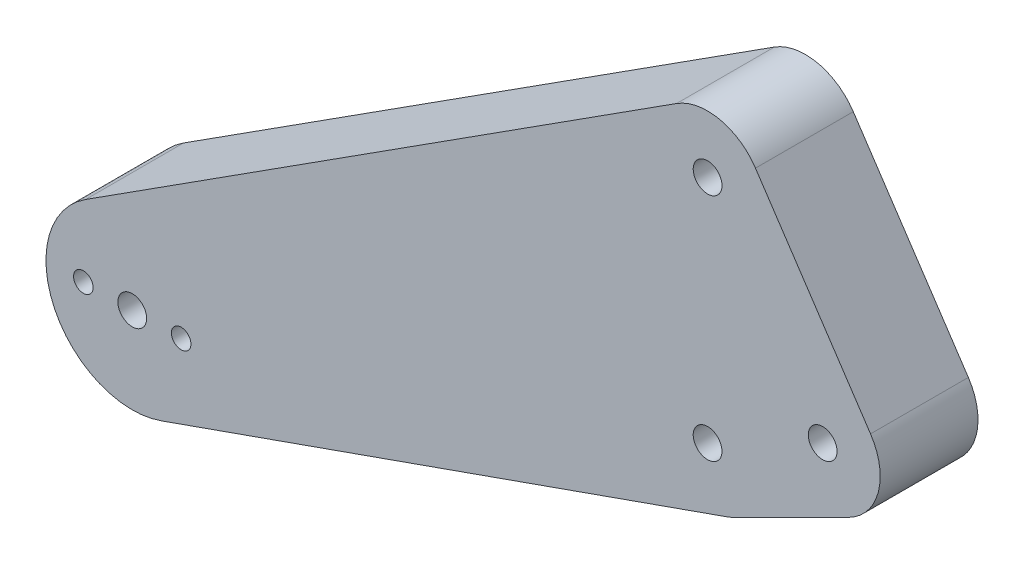
ISO-10303-21;
HEADER;
FILE_DESCRIPTION(('STEP AP214'),'2;1');
FILE_NAME('part.step','',(''),(''),'','','');
FILE_SCHEMA(('AUTOMOTIVE_DESIGN { 1 0 10303 214 1 1 1 1 }'));
ENDSEC;
DATA;
#1=APPLICATION_CONTEXT('core data for automotive mechanical design processes');
#2=APPLICATION_PROTOCOL_DEFINITION('international standard','automotive_design',2000,#1);
#3=PRODUCT_CONTEXT('',#1,'mechanical');
#4=PRODUCT('Part','Part','',(#3));
#5=PRODUCT_RELATED_PRODUCT_CATEGORY('part','',(#4));
#6=PRODUCT_DEFINITION_FORMATION('','',#4);
#7=PRODUCT_DEFINITION_CONTEXT('part definition',#1,'design');
#8=PRODUCT_DEFINITION('design','',#6,#7);
#9=PRODUCT_DEFINITION_SHAPE('','',#8);
#10=(LENGTH_UNIT() NAMED_UNIT(*) SI_UNIT(.MILLI.,.METRE.));
#11=(NAMED_UNIT(*) PLANE_ANGLE_UNIT() SI_UNIT($,.RADIAN.));
#12=(NAMED_UNIT(*) SI_UNIT($,.STERADIAN.) SOLID_ANGLE_UNIT());
#13=UNCERTAINTY_MEASURE_WITH_UNIT(LENGTH_MEASURE(1.E-05),#10,'distance_accuracy_value','');
#14=(GEOMETRIC_REPRESENTATION_CONTEXT(3) GLOBAL_UNCERTAINTY_ASSIGNED_CONTEXT((#13)) GLOBAL_UNIT_ASSIGNED_CONTEXT((#10,
#11,#12)) REPRESENTATION_CONTEXT('',''));
#15=CARTESIAN_POINT('',(0.,0.,0.));
#16=DIRECTION('',(0.,0.,1.));
#17=DIRECTION('',(1.,0.,0.));
#18=AXIS2_PLACEMENT_3D('',#15,#16,#17);
#19=CARTESIAN_POINT('',(0.,40.,17.));
#20=DIRECTION('',(0.,0.,-1.));
#21=DIRECTION('',(-1.,0.,0.));
#22=AXIS2_PLACEMENT_3D('',#19,#20,#21);
#23=CYLINDRICAL_SURFACE('',#22,10.);
#24=CARTESIAN_POINT('',(0.,40.,0.));
#25=DIRECTION('',(0.,0.,1.));
#26=DIRECTION('',(-1.,0.,0.));
#27=AXIS2_PLACEMENT_3D('',#24,#25,#26);
#28=CIRCLE('',#27,10.);
#29=CARTESIAN_POINT('',(8.32050294337844,45.5470019622523,0.));
#30=VERTEX_POINT('',#29);
#31=CARTESIAN_POINT('',(-5.3942400284264,48.420342897752,0.));
#32=VERTEX_POINT('',#31);
#33=EDGE_CURVE('E136',#30,#32,#28,.T.);
#34=ORIENTED_EDGE('',*,*,#33,.T.);
#35=DIRECTION('',(0.,0.,-1.));
#36=VECTOR('',#35,1.);
#37=CARTESIAN_POINT('',(-5.3942400284264,48.420342897752,17.));
#38=LINE('',#37,#36);
#39=CARTESIAN_POINT('',(-5.3942400284264,48.420342897752,17.));
#40=VERTEX_POINT('',#39);
#41=EDGE_CURVE('E11',#40,#32,#38,.T.);
#42=ORIENTED_EDGE('',*,*,#41,.F.);
#43=CARTESIAN_POINT('',(0.,40.,17.));
#44=DIRECTION('',(0.,0.,1.));
#45=DIRECTION('',(-1.,0.,0.));
#46=AXIS2_PLACEMENT_3D('',#43,#44,#45);
#47=CIRCLE('',#46,10.);
#48=CARTESIAN_POINT('',(8.32050294337844,45.5470019622523,17.));
#49=VERTEX_POINT('',#48);
#50=EDGE_CURVE('E151',#49,#40,#47,.T.);
#51=ORIENTED_EDGE('',*,*,#50,.F.);
#52=DIRECTION('',(0.,0.,-1.));
#53=VECTOR('',#52,1.);
#54=CARTESIAN_POINT('',(8.32050294337844,45.5470019622523,17.));
#55=LINE('',#54,#53);
#56=EDGE_CURVE('E132',#49,#30,#55,.T.);
#57=ORIENTED_EDGE('',*,*,#56,.T.);
#58=EDGE_LOOP('',(#34,#42,#51,#57));
#59=FACE_BOUND('',#58,.T.);
#60=ADVANCED_FACE('F40',(#59),#23,.T.);
#61=CARTESIAN_POINT('',(-108.09136004264,-17.369485653372,17.));
#62=DIRECTION('',(0.539424002842639,-0.842034289775199,0.));
#63=DIRECTION('',(0.842034289775199,0.539424002842639,0.));
#64=AXIS2_PLACEMENT_3D('',#61,#62,#63);
#65=PLANE('',#64);
#66=DIRECTION('',(-0.842034289775199,-0.539424002842639,0.));
#67=VECTOR('',#66,1.);
#68=CARTESIAN_POINT('',(-108.09136004264,-17.369485653372,0.));
#69=LINE('',#68,#67);
#70=CARTESIAN_POINT('',(-108.09136004264,-17.369485653372,0.));
#71=VERTEX_POINT('',#70);
#72=EDGE_CURVE('E139',#32,#71,#69,.T.);
#73=ORIENTED_EDGE('',*,*,#72,.T.);
#74=DIRECTION('',(0.,0.,-1.));
#75=VECTOR('',#74,1.);
#76=CARTESIAN_POINT('',(-108.09136004264,-17.369485653372,17.));
#77=LINE('',#76,#75);
#78=CARTESIAN_POINT('',(-108.09136004264,-17.369485653372,17.));
#79=VERTEX_POINT('',#78);
#80=EDGE_CURVE('E48',#79,#71,#77,.T.);
#81=ORIENTED_EDGE('',*,*,#80,.F.);
#82=DIRECTION('',(-0.842034289775199,-0.539424002842639,0.));
#83=VECTOR('',#82,1.);
#84=CARTESIAN_POINT('',(-108.09136004264,-17.369485653372,17.));
#85=LINE('',#84,#83);
#86=EDGE_CURVE('E99',#40,#79,#85,.T.);
#87=ORIENTED_EDGE('',*,*,#86,.F.);
#88=ORIENTED_EDGE('',*,*,#41,.T.);
#89=EDGE_LOOP('',(#73,#81,#87,#88));
#90=FACE_BOUND('',#89,.T.);
#91=ADVANCED_FACE('F258',(#90),#65,.F.);
#92=CARTESIAN_POINT('',(-100.,-30.,17.));
#93=DIRECTION('',(0.,0.,-1.));
#94=DIRECTION('',(-1.,0.,0.));
#95=AXIS2_PLACEMENT_3D('',#92,#93,#94);
#96=CYLINDRICAL_SURFACE('',#95,15.);
#97=CARTESIAN_POINT('',(-100.,-30.,0.));
#98=DIRECTION('',(0.,0.,1.));
#99=DIRECTION('',(-1.,0.,0.));
#100=AXIS2_PLACEMENT_3D('',#97,#98,#99);
#101=CIRCLE('',#100,15.);
#102=CARTESIAN_POINT('',(-95.0066540703778,-44.144486432074,0.));
#103=VERTEX_POINT('',#102);
#104=EDGE_CURVE('E142',#71,#103,#101,.T.);
#105=ORIENTED_EDGE('',*,*,#104,.T.);
#106=DIRECTION('',(0.,0.,-1.));
#107=VECTOR('',#106,1.);
#108=CARTESIAN_POINT('',(-95.0066540703778,-44.144486432074,17.));
#109=LINE('',#108,#107);
#110=CARTESIAN_POINT('',(-95.0066540703778,-44.144486432074,17.));
#111=VERTEX_POINT('',#110);
#112=EDGE_CURVE('E158',#111,#103,#109,.T.);
#113=ORIENTED_EDGE('',*,*,#112,.F.);
#114=CARTESIAN_POINT('',(-100.,-30.,17.));
#115=DIRECTION('',(0.,0.,1.));
#116=DIRECTION('',(-1.,0.,0.));
#117=AXIS2_PLACEMENT_3D('',#114,#115,#116);
#118=CIRCLE('',#117,15.);
#119=EDGE_CURVE('E166',#79,#111,#118,.T.);
#120=ORIENTED_EDGE('',*,*,#119,.F.);
#121=ORIENTED_EDGE('',*,*,#80,.T.);
#122=EDGE_LOOP('',(#105,#113,#120,#121));
#123=FACE_BOUND('',#122,.T.);
#124=ADVANCED_FACE('F164',(#123),#96,.T.);
#125=CARTESIAN_POINT('',(3.3288972864148,-9.42965762138266,17.));
#126=DIRECTION('',(-0.33288972864148,0.942965762138267,0.));
#127=DIRECTION('',(-0.942965762138267,-0.33288972864148,0.));
#128=AXIS2_PLACEMENT_3D('',#125,#126,#127);
#129=PLANE('',#128);
#130=DIRECTION('',(0.942965762138266,0.33288972864148,0.));
#131=VECTOR('',#130,1.);
#132=CARTESIAN_POINT('',(3.3288972864148,-9.42965762138266,0.));
#133=LINE('',#132,#131);
#134=CARTESIAN_POINT('',(3.3288972864148,-9.42965762138267,0.));
#135=VERTEX_POINT('',#134);
#136=EDGE_CURVE('E144',#103,#135,#133,.T.);
#137=ORIENTED_EDGE('',*,*,#136,.T.);
#138=DIRECTION('',(0.,0.,-1.));
#139=VECTOR('',#138,1.);
#140=CARTESIAN_POINT('',(3.3288972864148,-9.42965762138267,17.));
#141=LINE('',#140,#139);
#142=CARTESIAN_POINT('',(3.3288972864148,-9.42965762138267,17.));
#143=VERTEX_POINT('',#142);
#144=EDGE_CURVE('E155',#143,#135,#141,.T.);
#145=ORIENTED_EDGE('',*,*,#144,.F.);
#146=DIRECTION('',(0.942965762138266,0.33288972864148,0.));
#147=VECTOR('',#146,1.);
#148=CARTESIAN_POINT('',(3.3288972864148,-9.42965762138266,17.));
#149=LINE('',#148,#147);
#150=EDGE_CURVE('E178',#111,#143,#149,.T.);
#151=ORIENTED_EDGE('',*,*,#150,.F.);
#152=ORIENTED_EDGE('',*,*,#112,.T.);
#153=EDGE_LOOP('',(#137,#145,#151,#152));
#154=FACE_BOUND('',#153,.T.);
#155=ADVANCED_FACE('F174',(#154),#129,.F.);
#156=CARTESIAN_POINT('',(0.,0.,17.));
#157=DIRECTION('',(0.,0.,-1.));
#158=DIRECTION('',(-1.,0.,0.));
#159=AXIS2_PLACEMENT_3D('',#156,#157,#158);
#160=CYLINDRICAL_SURFACE('',#159,10.);
#161=CARTESIAN_POINT('',(0.,0.,0.));
#162=DIRECTION('',(0.,0.,1.));
#163=DIRECTION('',(-1.,0.,0.));
#164=AXIS2_PLACEMENT_3D('',#161,#162,#163);
#165=CIRCLE('',#164,10.);
#166=CARTESIAN_POINT('',(4.47213595499958,-8.94427190999916,0.));
#167=VERTEX_POINT('',#166);
#168=EDGE_CURVE('E146',#135,#167,#165,.T.);
#169=ORIENTED_EDGE('',*,*,#168,.T.);
#170=DIRECTION('',(0.,0.,-1.));
#171=VECTOR('',#170,1.);
#172=CARTESIAN_POINT('',(4.47213595499958,-8.94427190999916,17.));
#173=LINE('',#172,#171);
#174=CARTESIAN_POINT('',(4.47213595499958,-8.94427190999916,17.));
#175=VERTEX_POINT('',#174);
#176=EDGE_CURVE('E127',#175,#167,#173,.T.);
#177=ORIENTED_EDGE('',*,*,#176,.F.);
#178=CARTESIAN_POINT('',(0.,0.,17.));
#179=DIRECTION('',(0.,0.,1.));
#180=DIRECTION('',(-1.,0.,0.));
#181=AXIS2_PLACEMENT_3D('',#178,#179,#180);
#182=CIRCLE('',#181,10.);
#183=EDGE_CURVE('E118',#143,#175,#182,.T.);
#184=ORIENTED_EDGE('',*,*,#183,.F.);
#185=ORIENTED_EDGE('',*,*,#144,.T.);
#186=EDGE_LOOP('',(#169,#177,#184,#185));
#187=FACE_BOUND('',#186,.T.);
#188=ADVANCED_FACE('F177',(#187),#160,.T.);
#189=CARTESIAN_POINT('',(24.4721359549996,1.05572809000084,17.));
#190=DIRECTION('',(-0.447213595499958,0.894427190999916,0.));
#191=DIRECTION('',(-0.894427190999916,-0.447213595499958,0.));
#192=AXIS2_PLACEMENT_3D('',#189,#190,#191);
#193=PLANE('',#192);
#194=DIRECTION('',(0.894427190999916,0.447213595499958,0.));
#195=VECTOR('',#194,1.);
#196=CARTESIAN_POINT('',(24.4721359549996,1.05572809000084,0.));
#197=LINE('',#196,#195);
#198=CARTESIAN_POINT('',(24.4721359549996,1.05572809000084,0.));
#199=VERTEX_POINT('',#198);
#200=EDGE_CURVE('E126',#167,#199,#197,.T.);
#201=ORIENTED_EDGE('',*,*,#200,.T.);
#202=DIRECTION('',(0.,0.,-1.));
#203=VECTOR('',#202,1.);
#204=CARTESIAN_POINT('',(24.4721359549996,1.05572809000084,17.));
#205=LINE('',#204,#203);
#206=CARTESIAN_POINT('',(24.4721359549996,1.05572809000084,17.));
#207=VERTEX_POINT('',#206);
#208=EDGE_CURVE('E123',#207,#199,#205,.T.);
#209=ORIENTED_EDGE('',*,*,#208,.F.);
#210=DIRECTION('',(0.894427190999916,0.447213595499958,0.));
#211=VECTOR('',#210,1.);
#212=CARTESIAN_POINT('',(24.4721359549996,1.05572809000084,17.));
#213=LINE('',#212,#211);
#214=EDGE_CURVE('E112',#175,#207,#213,.T.);
#215=ORIENTED_EDGE('',*,*,#214,.F.);
#216=ORIENTED_EDGE('',*,*,#176,.T.);
#217=EDGE_LOOP('',(#201,#209,#215,#216));
#218=FACE_BOUND('',#217,.T.);
#219=ADVANCED_FACE('F124',(#218),#193,.F.);
#220=CARTESIAN_POINT('',(20.,10.,17.));
#221=DIRECTION('',(0.,0.,-1.));
#222=DIRECTION('',(-1.,0.,0.));
#223=AXIS2_PLACEMENT_3D('',#220,#221,#222);
#224=CYLINDRICAL_SURFACE('',#223,10.);
#225=CARTESIAN_POINT('',(20.,10.,0.));
#226=DIRECTION('',(0.,0.,1.));
#227=DIRECTION('',(-1.,0.,0.));
#228=AXIS2_PLACEMENT_3D('',#225,#226,#227);
#229=CIRCLE('',#228,10.);
#230=CARTESIAN_POINT('',(28.3205029433784,15.5470019622523,0.));
#231=VERTEX_POINT('',#230);
#232=EDGE_CURVE('E85',#199,#231,#229,.T.);
#233=ORIENTED_EDGE('',*,*,#232,.T.);
#234=DIRECTION('',(0.,0.,-1.));
#235=VECTOR('',#234,1.);
#236=CARTESIAN_POINT('',(28.3205029433784,15.5470019622523,17.));
#237=LINE('',#236,#235);
#238=CARTESIAN_POINT('',(28.3205029433784,15.5470019622523,17.));
#239=VERTEX_POINT('',#238);
#240=EDGE_CURVE('E128',#239,#231,#237,.T.);
#241=ORIENTED_EDGE('',*,*,#240,.F.);
#242=CARTESIAN_POINT('',(20.,10.,17.));
#243=DIRECTION('',(0.,0.,1.));
#244=DIRECTION('',(-1.,0.,0.));
#245=AXIS2_PLACEMENT_3D('',#242,#243,#244);
#246=CIRCLE('',#245,10.);
#247=EDGE_CURVE('E116',#207,#239,#246,.T.);
#248=ORIENTED_EDGE('',*,*,#247,.F.);
#249=ORIENTED_EDGE('',*,*,#208,.T.);
#250=EDGE_LOOP('',(#233,#241,#248,#249));
#251=FACE_BOUND('',#250,.T.);
#252=ADVANCED_FACE('F130',(#251),#224,.T.);
#253=CARTESIAN_POINT('',(8.32050294337844,45.5470019622523,17.));
#254=DIRECTION('',(-0.832050294337844,-0.554700196225229,0.));
#255=DIRECTION('',(0.554700196225229,-0.832050294337844,0.));
#256=AXIS2_PLACEMENT_3D('',#253,#254,#255);
#257=PLANE('',#256);
#258=DIRECTION('',(-0.554700196225229,0.832050294337844,0.));
#259=VECTOR('',#258,1.);
#260=CARTESIAN_POINT('',(8.32050294337844,45.5470019622523,0.));
#261=LINE('',#260,#259);
#262=EDGE_CURVE('E91',#231,#30,#261,.T.);
#263=ORIENTED_EDGE('',*,*,#262,.T.);
#264=ORIENTED_EDGE('',*,*,#56,.F.);
#265=DIRECTION('',(-0.554700196225229,0.832050294337844,0.));
#266=VECTOR('',#265,1.);
#267=CARTESIAN_POINT('',(8.32050294337844,45.5470019622523,17.));
#268=LINE('',#267,#266);
#269=EDGE_CURVE('E56',#239,#49,#268,.T.);
#270=ORIENTED_EDGE('',*,*,#269,.F.);
#271=ORIENTED_EDGE('',*,*,#240,.T.);
#272=EDGE_LOOP('',(#263,#264,#270,#271));
#273=FACE_BOUND('',#272,.T.);
#274=ADVANCED_FACE('F231',(#273),#257,.F.);
#275=CARTESIAN_POINT('',(0.,40.,17.));
#276=DIRECTION('',(0.,0.,-1.));
#277=DIRECTION('',(-1.,0.,0.));
#278=AXIS2_PLACEMENT_3D('',#275,#276,#277);
#279=PLANE('',#278);
#280=CARTESIAN_POINT('',(-108.5,-30.,17.));
#281=DIRECTION('',(0.,0.,1.));
#282=DIRECTION('',(1.,0.,0.));
#283=AXIS2_PLACEMENT_3D('',#280,#281,#282);
#284=CIRCLE('',#283,1.70000000000001);
#285=CARTESIAN_POINT('',(-106.8,-30.,17.));
#286=VERTEX_POINT('',#285);
#287=EDGE_CURVE('E214',#286,#286,#284,.T.);
#288=ORIENTED_EDGE('',*,*,#287,.F.);
#289=EDGE_LOOP('',(#288));
#290=FACE_BOUND('',#289,.T.);
#291=CARTESIAN_POINT('',(-91.5,-30.,17.));
#292=DIRECTION('',(0.,0.,1.));
#293=DIRECTION('',(1.,0.,0.));
#294=AXIS2_PLACEMENT_3D('',#291,#292,#293);
#295=CIRCLE('',#294,1.70000000000001);
#296=CARTESIAN_POINT('',(-89.8,-30.,17.));
#297=VERTEX_POINT('',#296);
#298=EDGE_CURVE('E211',#297,#297,#295,.T.);
#299=ORIENTED_EDGE('',*,*,#298,.F.);
#300=EDGE_LOOP('',(#299));
#301=FACE_BOUND('',#300,.T.);
#302=CARTESIAN_POINT('',(-100.,-30.,17.));
#303=DIRECTION('',(0.,0.,1.));
#304=DIRECTION('',(1.,0.,0.));
#305=AXIS2_PLACEMENT_3D('',#302,#303,#304);
#306=CIRCLE('',#305,2.5);
#307=CARTESIAN_POINT('',(-97.5,-30.,17.));
#308=VERTEX_POINT('',#307);
#309=EDGE_CURVE('E203',#308,#308,#306,.T.);
#310=ORIENTED_EDGE('',*,*,#309,.F.);
#311=EDGE_LOOP('',(#310));
#312=FACE_BOUND('',#311,.T.);
#313=CARTESIAN_POINT('',(0.,0.,17.));
#314=DIRECTION('',(0.,0.,1.));
#315=DIRECTION('',(1.,0.,0.));
#316=AXIS2_PLACEMENT_3D('',#313,#314,#315);
#317=CIRCLE('',#316,2.5);
#318=CARTESIAN_POINT('',(2.5,0.,17.));
#319=VERTEX_POINT('',#318);
#320=EDGE_CURVE('E200',#319,#319,#317,.T.);
#321=ORIENTED_EDGE('',*,*,#320,.F.);
#322=EDGE_LOOP('',(#321));
#323=FACE_BOUND('',#322,.T.);
#324=CARTESIAN_POINT('',(0.,40.,17.));
#325=DIRECTION('',(0.,0.,1.));
#326=DIRECTION('',(1.,0.,0.));
#327=AXIS2_PLACEMENT_3D('',#324,#325,#326);
#328=CIRCLE('',#327,2.5);
#329=CARTESIAN_POINT('',(2.5,40.,17.));
#330=VERTEX_POINT('',#329);
#331=EDGE_CURVE('E194',#330,#330,#328,.T.);
#332=ORIENTED_EDGE('',*,*,#331,.F.);
#333=EDGE_LOOP('',(#332));
#334=FACE_BOUND('',#333,.T.);
#335=CARTESIAN_POINT('',(20.,10.,17.));
#336=DIRECTION('',(0.,0.,1.));
#337=DIRECTION('',(1.,0.,0.));
#338=AXIS2_PLACEMENT_3D('',#335,#336,#337);
#339=CIRCLE('',#338,2.5);
#340=CARTESIAN_POINT('',(22.5,10.,17.));
#341=VERTEX_POINT('',#340);
#342=EDGE_CURVE('E187',#341,#341,#339,.T.);
#343=ORIENTED_EDGE('',*,*,#342,.F.);
#344=EDGE_LOOP('',(#343));
#345=FACE_BOUND('',#344,.T.);
#346=ORIENTED_EDGE('',*,*,#50,.T.);
#347=ORIENTED_EDGE('',*,*,#86,.T.);
#348=ORIENTED_EDGE('',*,*,#119,.T.);
#349=ORIENTED_EDGE('',*,*,#150,.T.);
#350=ORIENTED_EDGE('',*,*,#183,.T.);
#351=ORIENTED_EDGE('',*,*,#214,.T.);
#352=ORIENTED_EDGE('',*,*,#247,.T.);
#353=ORIENTED_EDGE('',*,*,#269,.T.);
#354=EDGE_LOOP('',(#346,#347,#348,#349,#350,#351,#352,#353));
#355=FACE_BOUND('',#354,.T.);
#356=ADVANCED_FACE('F114',(#290,#301,#312,#323,#334,#345,#355),#279,.F.);
#357=CARTESIAN_POINT('',(0.,40.,0.));
#358=DIRECTION('',(0.,0.,-1.));
#359=DIRECTION('',(-1.,0.,0.));
#360=AXIS2_PLACEMENT_3D('',#357,#358,#359);
#361=PLANE('',#360);
#362=CARTESIAN_POINT('',(-108.5,-30.,0.));
#363=DIRECTION('',(0.,0.,1.));
#364=DIRECTION('',(1.,0.,0.));
#365=AXIS2_PLACEMENT_3D('',#362,#363,#364);
#366=CIRCLE('',#365,1.70000000000001);
#367=CARTESIAN_POINT('',(-106.8,-30.,0.));
#368=VERTEX_POINT('',#367);
#369=EDGE_CURVE('E188',#368,#368,#366,.T.);
#370=ORIENTED_EDGE('',*,*,#369,.T.);
#371=EDGE_LOOP('',(#370));
#372=FACE_BOUND('',#371,.T.);
#373=CARTESIAN_POINT('',(-91.5,-30.,0.));
#374=DIRECTION('',(0.,0.,1.));
#375=DIRECTION('',(1.,0.,0.));
#376=AXIS2_PLACEMENT_3D('',#373,#374,#375);
#377=CIRCLE('',#376,1.70000000000001);
#378=CARTESIAN_POINT('',(-89.8,-30.,0.));
#379=VERTEX_POINT('',#378);
#380=EDGE_CURVE('E208',#379,#379,#377,.T.);
#381=ORIENTED_EDGE('',*,*,#380,.T.);
#382=EDGE_LOOP('',(#381));
#383=FACE_BOUND('',#382,.T.);
#384=CARTESIAN_POINT('',(-100.,-30.,0.));
#385=DIRECTION('',(0.,0.,1.));
#386=DIRECTION('',(1.,0.,0.));
#387=AXIS2_PLACEMENT_3D('',#384,#385,#386);
#388=CIRCLE('',#387,2.5);
#389=CARTESIAN_POINT('',(-97.5,-30.,0.));
#390=VERTEX_POINT('',#389);
#391=EDGE_CURVE('E140',#390,#390,#388,.T.);
#392=ORIENTED_EDGE('',*,*,#391,.T.);
#393=EDGE_LOOP('',(#392));
#394=FACE_BOUND('',#393,.T.);
#395=CARTESIAN_POINT('',(0.,0.,0.));
#396=DIRECTION('',(0.,0.,1.));
#397=DIRECTION('',(1.,0.,0.));
#398=AXIS2_PLACEMENT_3D('',#395,#396,#397);
#399=CIRCLE('',#398,2.5);
#400=CARTESIAN_POINT('',(2.5,0.,0.));
#401=VERTEX_POINT('',#400);
#402=EDGE_CURVE('E197',#401,#401,#399,.T.);
#403=ORIENTED_EDGE('',*,*,#402,.T.);
#404=EDGE_LOOP('',(#403));
#405=FACE_BOUND('',#404,.T.);
#406=CARTESIAN_POINT('',(0.,40.,0.));
#407=DIRECTION('',(0.,0.,1.));
#408=DIRECTION('',(1.,0.,0.));
#409=AXIS2_PLACEMENT_3D('',#406,#407,#408);
#410=CIRCLE('',#409,2.5);
#411=CARTESIAN_POINT('',(2.5,40.,0.));
#412=VERTEX_POINT('',#411);
#413=EDGE_CURVE('E191',#412,#412,#410,.T.);
#414=ORIENTED_EDGE('',*,*,#413,.T.);
#415=EDGE_LOOP('',(#414));
#416=FACE_BOUND('',#415,.T.);
#417=CARTESIAN_POINT('',(20.,10.,0.));
#418=DIRECTION('',(0.,0.,1.));
#419=DIRECTION('',(1.,0.,0.));
#420=AXIS2_PLACEMENT_3D('',#417,#418,#419);
#421=CIRCLE('',#420,2.5);
#422=CARTESIAN_POINT('',(22.5,10.,0.));
#423=VERTEX_POINT('',#422);
#424=EDGE_CURVE('E184',#423,#423,#421,.T.);
#425=ORIENTED_EDGE('',*,*,#424,.T.);
#426=EDGE_LOOP('',(#425));
#427=FACE_BOUND('',#426,.T.);
#428=ORIENTED_EDGE('',*,*,#33,.F.);
#429=ORIENTED_EDGE('',*,*,#262,.F.);
#430=ORIENTED_EDGE('',*,*,#232,.F.);
#431=ORIENTED_EDGE('',*,*,#200,.F.);
#432=ORIENTED_EDGE('',*,*,#168,.F.);
#433=ORIENTED_EDGE('',*,*,#136,.F.);
#434=ORIENTED_EDGE('',*,*,#104,.F.);
#435=ORIENTED_EDGE('',*,*,#72,.F.);
#436=EDGE_LOOP('',(#428,#429,#430,#431,#432,#433,#434,#435));
#437=FACE_BOUND('',#436,.T.);
#438=ADVANCED_FACE('F170',(#372,#383,#394,#405,#416,#427,#437),#361,.T.);
#439=CARTESIAN_POINT('',(20.,10.,0.));
#440=DIRECTION('',(0.,0.,1.));
#441=DIRECTION('',(1.,0.,0.));
#442=AXIS2_PLACEMENT_3D('',#439,#440,#441);
#443=CYLINDRICAL_SURFACE('',#442,2.5);
#444=ORIENTED_EDGE('',*,*,#424,.F.);
#445=EDGE_LOOP('',(#444));
#446=FACE_BOUND('',#445,.T.);
#447=ORIENTED_EDGE('',*,*,#342,.T.);
#448=EDGE_LOOP('',(#447));
#449=FACE_BOUND('',#448,.T.);
#450=ADVANCED_FACE('F243',(#446,#449),#443,.F.);
#451=CARTESIAN_POINT('',(0.,40.,0.));
#452=DIRECTION('',(0.,0.,1.));
#453=DIRECTION('',(1.,0.,0.));
#454=AXIS2_PLACEMENT_3D('',#451,#452,#453);
#455=CYLINDRICAL_SURFACE('',#454,2.5);
#456=ORIENTED_EDGE('',*,*,#413,.F.);
#457=EDGE_LOOP('',(#456));
#458=FACE_BOUND('',#457,.T.);
#459=ORIENTED_EDGE('',*,*,#331,.T.);
#460=EDGE_LOOP('',(#459));
#461=FACE_BOUND('',#460,.T.);
#462=ADVANCED_FACE('F245',(#458,#461),#455,.F.);
#463=CARTESIAN_POINT('',(0.,0.,0.));
#464=DIRECTION('',(0.,0.,1.));
#465=DIRECTION('',(1.,0.,0.));
#466=AXIS2_PLACEMENT_3D('',#463,#464,#465);
#467=CYLINDRICAL_SURFACE('',#466,2.5);
#468=ORIENTED_EDGE('',*,*,#402,.F.);
#469=EDGE_LOOP('',(#468));
#470=FACE_BOUND('',#469,.T.);
#471=ORIENTED_EDGE('',*,*,#320,.T.);
#472=EDGE_LOOP('',(#471));
#473=FACE_BOUND('',#472,.T.);
#474=ADVANCED_FACE('F252',(#470,#473),#467,.F.);
#475=CARTESIAN_POINT('',(-100.,-30.,0.));
#476=DIRECTION('',(0.,0.,1.));
#477=DIRECTION('',(1.,0.,0.));
#478=AXIS2_PLACEMENT_3D('',#475,#476,#477);
#479=CYLINDRICAL_SURFACE('',#478,2.5);
#480=ORIENTED_EDGE('',*,*,#391,.F.);
#481=EDGE_LOOP('',(#480));
#482=FACE_BOUND('',#481,.T.);
#483=ORIENTED_EDGE('',*,*,#309,.T.);
#484=EDGE_LOOP('',(#483));
#485=FACE_BOUND('',#484,.T.);
#486=ADVANCED_FACE('F328',(#482,#485),#479,.F.);
#487=CARTESIAN_POINT('',(-91.5,-30.,0.));
#488=DIRECTION('',(0.,0.,1.));
#489=DIRECTION('',(1.,0.,0.));
#490=AXIS2_PLACEMENT_3D('',#487,#488,#489);
#491=CYLINDRICAL_SURFACE('',#490,1.70000000000001);
#492=ORIENTED_EDGE('',*,*,#380,.F.);
#493=EDGE_LOOP('',(#492));
#494=FACE_BOUND('',#493,.T.);
#495=ORIENTED_EDGE('',*,*,#298,.T.);
#496=EDGE_LOOP('',(#495));
#497=FACE_BOUND('',#496,.T.);
#498=ADVANCED_FACE('F225',(#494,#497),#491,.F.);
#499=CARTESIAN_POINT('',(-108.5,-30.,0.));
#500=DIRECTION('',(0.,0.,1.));
#501=DIRECTION('',(1.,0.,0.));
#502=AXIS2_PLACEMENT_3D('',#499,#500,#501);
#503=CYLINDRICAL_SURFACE('',#502,1.70000000000001);
#504=ORIENTED_EDGE('',*,*,#369,.F.);
#505=EDGE_LOOP('',(#504));
#506=FACE_BOUND('',#505,.T.);
#507=ORIENTED_EDGE('',*,*,#287,.T.);
#508=EDGE_LOOP('',(#507));
#509=FACE_BOUND('',#508,.T.);
#510=ADVANCED_FACE('F222',(#506,#509),#503,.F.);
#511=CLOSED_SHELL('',(#60,#91,#124,#155,#188,#219,#252,#274,#356,#438,#450,#462,#474,#486,#498,#510));
#512=MANIFOLD_SOLID_BREP('B2',#511);
#513=ADVANCED_BREP_SHAPE_REPRESENTATION('',(#18,#512),#14);
#514=SHAPE_DEFINITION_REPRESENTATION(#9,#513);
ENDSEC;
END-ISO-10303-21;
